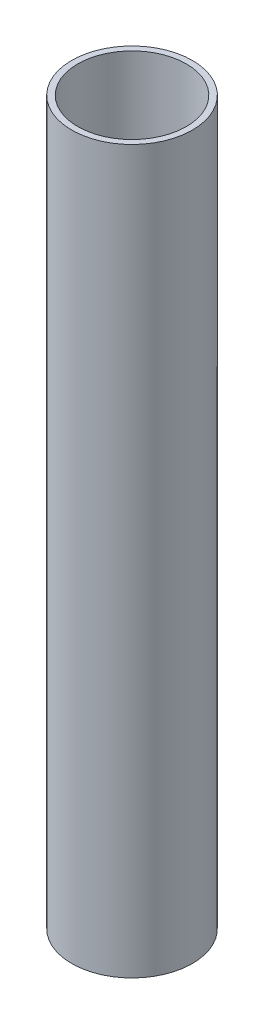
ISO-10303-21;
HEADER;
FILE_DESCRIPTION(('STEP AP214'),'2;1');
FILE_NAME('part.step','',(''),(''),'','','');
FILE_SCHEMA(('AUTOMOTIVE_DESIGN { 1 0 10303 214 1 1 1 1 }'));
ENDSEC;
DATA;
#1=APPLICATION_CONTEXT('core data for automotive mechanical design processes');
#2=APPLICATION_PROTOCOL_DEFINITION('international standard','automotive_design',2000,#1);
#3=PRODUCT_CONTEXT('',#1,'mechanical');
#4=PRODUCT('Part','Part','',(#3));
#5=PRODUCT_RELATED_PRODUCT_CATEGORY('part','',(#4));
#6=PRODUCT_DEFINITION_FORMATION('','',#4);
#7=PRODUCT_DEFINITION_CONTEXT('part definition',#1,'design');
#8=PRODUCT_DEFINITION('design','',#6,#7);
#9=PRODUCT_DEFINITION_SHAPE('','',#8);
#10=(LENGTH_UNIT() NAMED_UNIT(*) SI_UNIT(.MILLI.,.METRE.));
#11=(NAMED_UNIT(*) PLANE_ANGLE_UNIT() SI_UNIT($,.RADIAN.));
#12=(NAMED_UNIT(*) SI_UNIT($,.STERADIAN.) SOLID_ANGLE_UNIT());
#13=UNCERTAINTY_MEASURE_WITH_UNIT(LENGTH_MEASURE(1.E-05),#10,'distance_accuracy_value','');
#14=(GEOMETRIC_REPRESENTATION_CONTEXT(3) GLOBAL_UNCERTAINTY_ASSIGNED_CONTEXT((#13)) GLOBAL_UNIT_ASSIGNED_CONTEXT((#10,
#11,#12)) REPRESENTATION_CONTEXT('',''));
#15=CARTESIAN_POINT('',(0.,0.,0.));
#16=DIRECTION('',(0.,0.,1.));
#17=DIRECTION('',(1.,0.,0.));
#18=AXIS2_PLACEMENT_3D('',#15,#16,#17);
#19=CARTESIAN_POINT('',(0.,179.4,0.));
#20=DIRECTION('',(0.,1.,0.));
#21=DIRECTION('',(0.,0.,1.));
#22=AXIS2_PLACEMENT_3D('',#19,#20,#21);
#23=PLANE('',#22);
#24=CARTESIAN_POINT('',(0.,179.4,0.));
#25=DIRECTION('',(0.,1.,0.));
#26=DIRECTION('',(0.,0.,1.));
#27=AXIS2_PLACEMENT_3D('',#24,#25,#26);
#28=CIRCLE('',#27,15.);
#29=CARTESIAN_POINT('',(0.,179.4,-15.));
#30=VERTEX_POINT('',#29);
#31=EDGE_CURVE('E10',#30,#30,#28,.T.);
#32=ORIENTED_EDGE('',*,*,#31,.T.);
#33=EDGE_LOOP('',(#32));
#34=FACE_BOUND('',#33,.T.);
#35=CARTESIAN_POINT('',(0.,179.4,0.));
#36=DIRECTION('',(0.,1.,0.));
#37=DIRECTION('',(0.,0.,1.));
#38=AXIS2_PLACEMENT_3D('',#35,#36,#37);
#39=CIRCLE('',#38,13.5);
#40=CARTESIAN_POINT('',(0.,179.4,-13.5));
#41=VERTEX_POINT('',#40);
#42=EDGE_CURVE('E43',#41,#41,#39,.T.);
#43=ORIENTED_EDGE('',*,*,#42,.F.);
#44=EDGE_LOOP('',(#43));
#45=FACE_BOUND('',#44,.T.);
#46=ADVANCED_FACE('F32',(#34,#45),#23,.T.);
#47=CARTESIAN_POINT('',(0.,0.,0.));
#48=DIRECTION('',(0.,1.,0.));
#49=DIRECTION('',(0.,0.,1.));
#50=AXIS2_PLACEMENT_3D('',#47,#48,#49);
#51=PLANE('',#50);
#52=CARTESIAN_POINT('',(0.,0.,0.));
#53=DIRECTION('',(0.,1.,0.));
#54=DIRECTION('',(0.,0.,1.));
#55=AXIS2_PLACEMENT_3D('',#52,#53,#54);
#56=CIRCLE('',#55,15.);
#57=CARTESIAN_POINT('',(0.,0.,-15.));
#58=VERTEX_POINT('',#57);
#59=EDGE_CURVE('E36',#58,#58,#56,.T.);
#60=ORIENTED_EDGE('',*,*,#59,.F.);
#61=EDGE_LOOP('',(#60));
#62=FACE_BOUND('',#61,.T.);
#63=CARTESIAN_POINT('',(0.,0.,0.));
#64=DIRECTION('',(0.,1.,0.));
#65=DIRECTION('',(0.,0.,1.));
#66=AXIS2_PLACEMENT_3D('',#63,#64,#65);
#67=CIRCLE('',#66,13.5);
#68=CARTESIAN_POINT('',(0.,0.,-13.5));
#69=VERTEX_POINT('',#68);
#70=EDGE_CURVE('E45',#69,#69,#67,.T.);
#71=ORIENTED_EDGE('',*,*,#70,.T.);
#72=EDGE_LOOP('',(#71));
#73=FACE_BOUND('',#72,.T.);
#74=ADVANCED_FACE('F55',(#62,#73),#51,.F.);
#75=CARTESIAN_POINT('',(0.,179.4,0.));
#76=DIRECTION('',(0.,-1.,0.));
#77=DIRECTION('',(0.,0.,-1.));
#78=AXIS2_PLACEMENT_3D('',#75,#76,#77);
#79=CYLINDRICAL_SURFACE('',#78,15.);
#80=CARTESIAN_POINT('',(0.,179.4,-15.));
#81=CARTESIAN_POINT('',(0.,177.53125,-15.));
#82=CARTESIAN_POINT('',(0.,175.6625,-15.));
#83=CARTESIAN_POINT('',(0.,171.925,-15.));
#84=CARTESIAN_POINT('',(0.,170.05625,-15.));
#85=CARTESIAN_POINT('',(0.,166.31875,-15.));
#86=CARTESIAN_POINT('',(0.,164.45,-15.));
#87=CARTESIAN_POINT('',(0.,160.7125,-15.));
#88=CARTESIAN_POINT('',(0.,158.84375,-15.));
#89=CARTESIAN_POINT('',(0.,155.10625,-15.));
#90=CARTESIAN_POINT('',(0.,153.2375,-15.));
#91=CARTESIAN_POINT('',(0.,149.5,-15.));
#92=CARTESIAN_POINT('',(0.,147.63125,-15.));
#93=CARTESIAN_POINT('',(0.,143.89375,-15.));
#94=CARTESIAN_POINT('',(0.,142.025,-15.));
#95=CARTESIAN_POINT('',(0.,138.2875,-15.));
#96=CARTESIAN_POINT('',(0.,136.41875,-15.));
#97=CARTESIAN_POINT('',(0.,132.68125,-15.));
#98=CARTESIAN_POINT('',(0.,130.8125,-15.));
#99=CARTESIAN_POINT('',(0.,127.075,-15.));
#100=CARTESIAN_POINT('',(0.,125.20625,-15.));
#101=CARTESIAN_POINT('',(0.,121.46875,-15.));
#102=CARTESIAN_POINT('',(0.,119.6,-15.));
#103=CARTESIAN_POINT('',(0.,115.8625,-15.));
#104=CARTESIAN_POINT('',(0.,113.99375,-15.));
#105=CARTESIAN_POINT('',(0.,110.25625,-15.));
#106=CARTESIAN_POINT('',(0.,108.3875,-15.));
#107=CARTESIAN_POINT('',(0.,104.65,-15.));
#108=CARTESIAN_POINT('',(0.,102.78125,-15.));
#109=CARTESIAN_POINT('',(0.,99.04375,-15.));
#110=CARTESIAN_POINT('',(0.,97.175,-15.));
#111=CARTESIAN_POINT('',(0.,93.4375,-15.));
#112=CARTESIAN_POINT('',(0.,91.56875,-15.));
#113=CARTESIAN_POINT('',(0.,87.83125,-15.));
#114=CARTESIAN_POINT('',(0.,85.9625,-15.));
#115=CARTESIAN_POINT('',(0.,82.225,-15.));
#116=CARTESIAN_POINT('',(0.,80.35625,-15.));
#117=CARTESIAN_POINT('',(0.,76.61875,-15.));
#118=CARTESIAN_POINT('',(0.,74.75,-15.));
#119=CARTESIAN_POINT('',(0.,71.0125,-15.));
#120=CARTESIAN_POINT('',(0.,69.14375,-15.));
#121=CARTESIAN_POINT('',(0.,65.40625,-15.));
#122=CARTESIAN_POINT('',(0.,63.5375,-15.));
#123=CARTESIAN_POINT('',(0.,59.8,-15.));
#124=CARTESIAN_POINT('',(0.,57.93125,-15.));
#125=CARTESIAN_POINT('',(0.,54.19375,-15.));
#126=CARTESIAN_POINT('',(0.,52.325,-15.));
#127=CARTESIAN_POINT('',(0.,48.5875,-15.));
#128=CARTESIAN_POINT('',(0.,46.71875,-15.));
#129=CARTESIAN_POINT('',(0.,42.98125,-15.));
#130=CARTESIAN_POINT('',(0.,41.1125,-15.));
#131=CARTESIAN_POINT('',(0.,37.375,-15.));
#132=CARTESIAN_POINT('',(0.,35.50625,-15.));
#133=CARTESIAN_POINT('',(0.,31.76875,-15.));
#134=CARTESIAN_POINT('',(0.,29.9,-15.));
#135=CARTESIAN_POINT('',(0.,26.1625,-15.));
#136=CARTESIAN_POINT('',(0.,24.29375,-15.));
#137=CARTESIAN_POINT('',(0.,20.55625,-15.));
#138=CARTESIAN_POINT('',(0.,18.6875,-15.));
#139=CARTESIAN_POINT('',(0.,14.95,-15.));
#140=CARTESIAN_POINT('',(0.,13.08125,-15.));
#141=CARTESIAN_POINT('',(0.,9.34374999999998,-15.));
#142=CARTESIAN_POINT('',(0.,7.47499999999998,-15.));
#143=CARTESIAN_POINT('',(0.,3.73749999999998,-15.));
#144=CARTESIAN_POINT('',(0.,1.86874999999997,-15.));
#145=CARTESIAN_POINT('',(0.,0.,-15.));
#146=B_SPLINE_CURVE_WITH_KNOTS('',3,(#80,#81,#82,#83,#84,#85,#86,#87,#88,#89,#90,#91,#92,#93,
#94,#95,#96,#97,#98,#99,#100,#101,#102,#103,#104,#105,#106,#107,#108,#109,#110,#111,#112,#113,
#114,#115,#116,#117,#118,#119,#120,#121,#122,#123,#124,#125,#126,#127,#128,#129,#130,#131,#132,
#133,#134,#135,#136,#137,#138,#139,#140,#141,#142,#143,#144,#145),.UNSPECIFIED.,.F.,.F.,(4,2,2,
2,2,2,2,2,2,2,2,2,2,2,2,2,2,2,2,2,2,2,2,2,2,2,2,2,2,2,2,2,4),(0.,5.60625000000001,11.2125,
16.81875,22.425,28.03125,33.6375,39.24375,44.85,50.45625,56.0625,61.66875,67.275,72.88125,
78.4875,84.09375,89.7,95.30625,100.9125,106.51875,112.125,117.73125,123.3375,128.94375,134.55,
140.15625,145.7625,151.36875,156.975,162.58125,168.1875,173.79375,179.4),.UNSPECIFIED.);
#147=EDGE_CURVE('BSEAM34',#30,#58,#146,.T.);
#148=ORIENTED_EDGE('',*,*,#31,.F.);
#149=ORIENTED_EDGE('',*,*,#59,.T.);
#150=ORIENTED_EDGE('',*,*,#147,.T.);
#151=ORIENTED_EDGE('',*,*,#147,.F.);
#152=EDGE_LOOP('',(#148,#150,#149,#151));
#153=FACE_BOUND('',#152,.T.);
#154=ADVANCED_FACE('F34',(#153),#79,.T.);
#155=CARTESIAN_POINT('',(0.,179.4,0.));
#156=DIRECTION('',(0.,-1.,0.));
#157=DIRECTION('',(0.,0.,-1.));
#158=AXIS2_PLACEMENT_3D('',#155,#156,#157);
#159=CYLINDRICAL_SURFACE('',#158,13.5);
#160=CARTESIAN_POINT('',(0.,179.4,-13.5));
#161=CARTESIAN_POINT('',(0.,177.53125,-13.5));
#162=CARTESIAN_POINT('',(0.,175.6625,-13.5));
#163=CARTESIAN_POINT('',(0.,171.925,-13.5));
#164=CARTESIAN_POINT('',(0.,170.05625,-13.5));
#165=CARTESIAN_POINT('',(0.,166.31875,-13.5));
#166=CARTESIAN_POINT('',(0.,164.45,-13.5));
#167=CARTESIAN_POINT('',(0.,160.7125,-13.5));
#168=CARTESIAN_POINT('',(0.,158.84375,-13.5));
#169=CARTESIAN_POINT('',(0.,155.10625,-13.5));
#170=CARTESIAN_POINT('',(0.,153.2375,-13.5));
#171=CARTESIAN_POINT('',(0.,149.5,-13.5));
#172=CARTESIAN_POINT('',(0.,147.63125,-13.5));
#173=CARTESIAN_POINT('',(0.,143.89375,-13.5));
#174=CARTESIAN_POINT('',(0.,142.025,-13.5));
#175=CARTESIAN_POINT('',(0.,138.2875,-13.5));
#176=CARTESIAN_POINT('',(0.,136.41875,-13.5));
#177=CARTESIAN_POINT('',(0.,132.68125,-13.5));
#178=CARTESIAN_POINT('',(0.,130.8125,-13.5));
#179=CARTESIAN_POINT('',(0.,127.075,-13.5));
#180=CARTESIAN_POINT('',(0.,125.20625,-13.5));
#181=CARTESIAN_POINT('',(0.,121.46875,-13.5));
#182=CARTESIAN_POINT('',(0.,119.6,-13.5));
#183=CARTESIAN_POINT('',(0.,115.8625,-13.5));
#184=CARTESIAN_POINT('',(0.,113.99375,-13.5));
#185=CARTESIAN_POINT('',(0.,110.25625,-13.5));
#186=CARTESIAN_POINT('',(0.,108.3875,-13.5));
#187=CARTESIAN_POINT('',(0.,104.65,-13.5));
#188=CARTESIAN_POINT('',(0.,102.78125,-13.5));
#189=CARTESIAN_POINT('',(0.,99.04375,-13.5));
#190=CARTESIAN_POINT('',(0.,97.175,-13.5));
#191=CARTESIAN_POINT('',(0.,93.4375,-13.5));
#192=CARTESIAN_POINT('',(0.,91.56875,-13.5));
#193=CARTESIAN_POINT('',(0.,87.83125,-13.5));
#194=CARTESIAN_POINT('',(0.,85.9625,-13.5));
#195=CARTESIAN_POINT('',(0.,82.225,-13.5));
#196=CARTESIAN_POINT('',(0.,80.35625,-13.5));
#197=CARTESIAN_POINT('',(0.,76.61875,-13.5));
#198=CARTESIAN_POINT('',(0.,74.75,-13.5));
#199=CARTESIAN_POINT('',(0.,71.0125,-13.5));
#200=CARTESIAN_POINT('',(0.,69.14375,-13.5));
#201=CARTESIAN_POINT('',(0.,65.40625,-13.5));
#202=CARTESIAN_POINT('',(0.,63.5375,-13.5));
#203=CARTESIAN_POINT('',(0.,59.8,-13.5));
#204=CARTESIAN_POINT('',(0.,57.93125,-13.5));
#205=CARTESIAN_POINT('',(0.,54.19375,-13.5));
#206=CARTESIAN_POINT('',(0.,52.325,-13.5));
#207=CARTESIAN_POINT('',(0.,48.5875,-13.5));
#208=CARTESIAN_POINT('',(0.,46.71875,-13.5));
#209=CARTESIAN_POINT('',(0.,42.98125,-13.5));
#210=CARTESIAN_POINT('',(0.,41.1125,-13.5));
#211=CARTESIAN_POINT('',(0.,37.375,-13.5));
#212=CARTESIAN_POINT('',(0.,35.50625,-13.5));
#213=CARTESIAN_POINT('',(0.,31.76875,-13.5));
#214=CARTESIAN_POINT('',(0.,29.9,-13.5));
#215=CARTESIAN_POINT('',(0.,26.1625,-13.5));
#216=CARTESIAN_POINT('',(0.,24.29375,-13.5));
#217=CARTESIAN_POINT('',(0.,20.55625,-13.5));
#218=CARTESIAN_POINT('',(0.,18.6875,-13.5));
#219=CARTESIAN_POINT('',(0.,14.95,-13.5));
#220=CARTESIAN_POINT('',(0.,13.08125,-13.5));
#221=CARTESIAN_POINT('',(0.,9.34374999999998,-13.5));
#222=CARTESIAN_POINT('',(0.,7.47499999999998,-13.5));
#223=CARTESIAN_POINT('',(0.,3.73749999999998,-13.5));
#224=CARTESIAN_POINT('',(0.,1.86874999999997,-13.5));
#225=CARTESIAN_POINT('',(0.,0.,-13.5));
#226=B_SPLINE_CURVE_WITH_KNOTS('',3,(#160,#161,#162,#163,#164,#165,#166,#167,#168,#169,#170,
#171,#172,#173,#174,#175,#176,#177,#178,#179,#180,#181,#182,#183,#184,#185,#186,#187,#188,#189,
#190,#191,#192,#193,#194,#195,#196,#197,#198,#199,#200,#201,#202,#203,#204,#205,#206,#207,#208,
#209,#210,#211,#212,#213,#214,#215,#216,#217,#218,#219,#220,#221,#222,#223,#224,#225),
.UNSPECIFIED.,.F.,.F.,(4,2,2,2,2,2,2,2,2,2,2,2,2,2,2,2,2,2,2,2,2,2,2,2,2,2,2,2,2,2,2,2,4),(0.,
5.60624999999998,11.2125,16.81875,22.425,28.03125,33.6375,39.24375,44.85,50.45625,56.0625,
61.66875,67.275,72.88125,78.4875,84.09375,89.7,95.30625,100.9125,106.51875,112.125,117.73125,
123.3375,128.94375,134.55,140.15625,145.7625,151.36875,156.975,162.58125,168.1875,173.79375,
179.4),.UNSPECIFIED.);
#227=EDGE_CURVE('BSEAM51',#41,#69,#226,.T.);
#228=ORIENTED_EDGE('',*,*,#42,.T.);
#229=ORIENTED_EDGE('',*,*,#70,.F.);
#230=ORIENTED_EDGE('',*,*,#227,.T.);
#231=ORIENTED_EDGE('',*,*,#227,.F.);
#232=EDGE_LOOP('',(#228,#230,#229,#231));
#233=FACE_BOUND('',#232,.T.);
#234=ADVANCED_FACE('F51',(#233),#159,.F.);
#235=CLOSED_SHELL('',(#46,#74,#154,#234));
#236=MANIFOLD_SOLID_BREP('B2',#235);
#237=ADVANCED_BREP_SHAPE_REPRESENTATION('',(#18,#236),#14);
#238=SHAPE_DEFINITION_REPRESENTATION(#9,#237);
ENDSEC;
END-ISO-10303-21;
